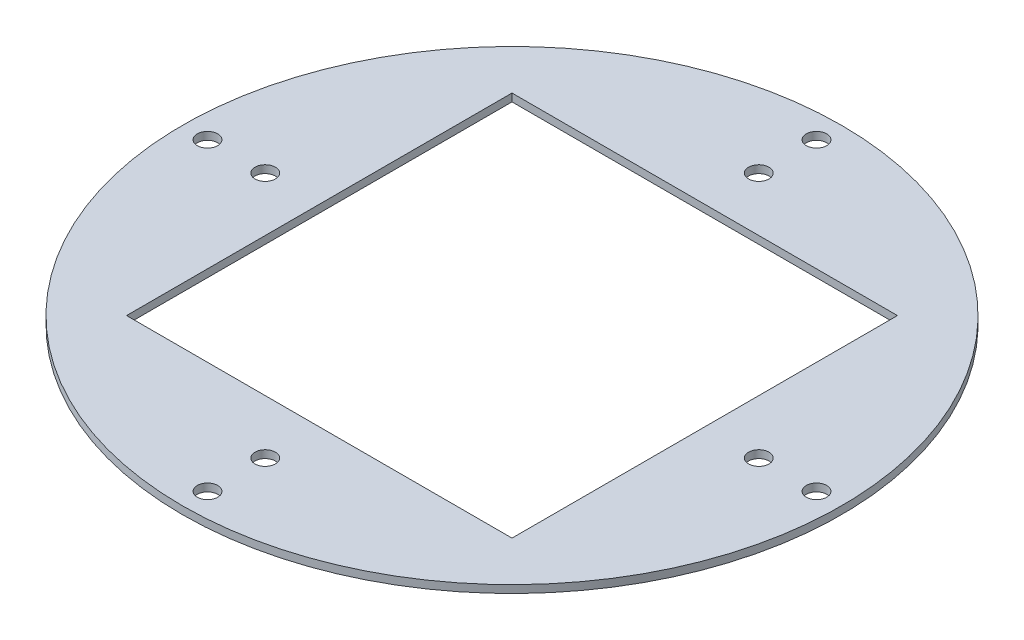
ISO-10303-21;
HEADER;
FILE_DESCRIPTION(('STEP AP214'),'2;1');
FILE_NAME('part.step','',(''),(''),'','','');
FILE_SCHEMA(('AUTOMOTIVE_DESIGN { 1 0 10303 214 1 1 1 1 }'));
ENDSEC;
DATA;
#1=APPLICATION_CONTEXT('core data for automotive mechanical design processes');
#2=APPLICATION_PROTOCOL_DEFINITION('international standard','automotive_design',2000,#1);
#3=PRODUCT_CONTEXT('',#1,'mechanical');
#4=PRODUCT('Part','Part','',(#3));
#5=PRODUCT_RELATED_PRODUCT_CATEGORY('part','',(#4));
#6=PRODUCT_DEFINITION_FORMATION('','',#4);
#7=PRODUCT_DEFINITION_CONTEXT('part definition',#1,'design');
#8=PRODUCT_DEFINITION('design','',#6,#7);
#9=PRODUCT_DEFINITION_SHAPE('','',#8);
#10=(LENGTH_UNIT() NAMED_UNIT(*) SI_UNIT(.MILLI.,.METRE.));
#11=(NAMED_UNIT(*) PLANE_ANGLE_UNIT() SI_UNIT($,.RADIAN.));
#12=(NAMED_UNIT(*) SI_UNIT($,.STERADIAN.) SOLID_ANGLE_UNIT());
#13=UNCERTAINTY_MEASURE_WITH_UNIT(LENGTH_MEASURE(1.E-05),#10,'distance_accuracy_value','');
#14=(GEOMETRIC_REPRESENTATION_CONTEXT(3) GLOBAL_UNCERTAINTY_ASSIGNED_CONTEXT((#13)) GLOBAL_UNIT_ASSIGNED_CONTEXT((#10,
#11,#12)) REPRESENTATION_CONTEXT('',''));
#15=CARTESIAN_POINT('',(0.,0.,0.));
#16=DIRECTION('',(0.,0.,1.));
#17=DIRECTION('',(1.,0.,0.));
#18=AXIS2_PLACEMENT_3D('',#15,#16,#17);
#19=CARTESIAN_POINT('',(0.,2.,0.));
#20=DIRECTION('',(0.,1.,0.));
#21=DIRECTION('',(0.,0.,1.));
#22=AXIS2_PLACEMENT_3D('',#19,#20,#21);
#23=PLANE('',#22);
#24=DIRECTION('',(0.,0.,-1.));
#25=VECTOR('',#24,1.);
#26=CARTESIAN_POINT('',(50.,2.,50.));
#27=LINE('',#26,#25);
#28=CARTESIAN_POINT('',(50.,2.,50.));
#29=VERTEX_POINT('',#28);
#30=CARTESIAN_POINT('',(50.,2.,-50.));
#31=VERTEX_POINT('',#30);
#32=EDGE_CURVE('E123',#29,#31,#27,.T.);
#33=ORIENTED_EDGE('',*,*,#32,.F.);
#34=DIRECTION('',(1.,0.,0.));
#35=VECTOR('',#34,1.);
#36=CARTESIAN_POINT('',(0.,2.,50.));
#37=LINE('',#36,#35);
#38=CARTESIAN_POINT('',(-50.,2.,50.));
#39=VERTEX_POINT('',#38);
#40=EDGE_CURVE('E83',#39,#29,#37,.T.);
#41=ORIENTED_EDGE('',*,*,#40,.F.);
#42=DIRECTION('',(0.,0.,1.));
#43=VECTOR('',#42,1.);
#44=CARTESIAN_POINT('',(-50.,2.,50.));
#45=LINE('',#44,#43);
#46=CARTESIAN_POINT('',(-50.,2.,-50.));
#47=VERTEX_POINT('',#46);
#48=EDGE_CURVE('E120',#47,#39,#45,.T.);
#49=ORIENTED_EDGE('',*,*,#48,.F.);
#50=DIRECTION('',(1.,0.,0.));
#51=VECTOR('',#50,1.);
#52=CARTESIAN_POINT('',(0.,2.,-50.));
#53=LINE('',#52,#51);
#54=EDGE_CURVE('E106',#47,#31,#53,.T.);
#55=ORIENTED_EDGE('',*,*,#54,.T.);
#56=EDGE_LOOP('',(#33,#41,#49,#55));
#57=FACE_BOUND('',#56,.T.);
#58=CARTESIAN_POINT('',(0.,2.,-64.0312423743285));
#59=DIRECTION('',(0.,1.,0.));
#60=DIRECTION('',(0.,0.,1.));
#61=AXIS2_PLACEMENT_3D('',#58,#59,#60);
#62=CIRCLE('',#61,2.65);
#63=CARTESIAN_POINT('',(0.,2.,-61.3812423743285));
#64=VERTEX_POINT('',#63);
#65=EDGE_CURVE('E139',#64,#64,#62,.T.);
#66=ORIENTED_EDGE('',*,*,#65,.F.);
#67=EDGE_LOOP('',(#66));
#68=FACE_BOUND('',#67,.T.);
#69=CARTESIAN_POINT('',(-64.0312423743285,2.,-6.70691663558729E-13));
#70=DIRECTION('',(0.,1.,0.));
#71=DIRECTION('',(0.,0.,1.));
#72=AXIS2_PLACEMENT_3D('',#69,#70,#71);
#73=CIRCLE('',#72,2.65);
#74=CARTESIAN_POINT('',(-64.0312423743285,2.,2.64999999999933));
#75=VERTEX_POINT('',#74);
#76=EDGE_CURVE('E143',#75,#75,#73,.T.);
#77=ORIENTED_EDGE('',*,*,#76,.F.);
#78=EDGE_LOOP('',(#77));
#79=FACE_BOUND('',#78,.T.);
#80=CARTESIAN_POINT('',(64.0312423743285,2.,2.2356388785291E-13));
#81=DIRECTION('',(0.,1.,0.));
#82=DIRECTION('',(0.,0.,1.));
#83=AXIS2_PLACEMENT_3D('',#80,#81,#82);
#84=CIRCLE('',#83,2.65);
#85=CARTESIAN_POINT('',(64.0312423743285,2.,2.65000000000022));
#86=VERTEX_POINT('',#85);
#87=EDGE_CURVE('E151',#86,#86,#84,.T.);
#88=ORIENTED_EDGE('',*,*,#87,.F.);
#89=EDGE_LOOP('',(#88));
#90=FACE_BOUND('',#89,.T.);
#91=CARTESIAN_POINT('',(-4.47127775705819E-13,2.,64.0312423743285));
#92=DIRECTION('',(0.,1.,0.));
#93=DIRECTION('',(0.,0.,1.));
#94=AXIS2_PLACEMENT_3D('',#91,#92,#93);
#95=CIRCLE('',#94,2.65);
#96=CARTESIAN_POINT('',(-4.47127775705819E-13,2.,66.6812423743285));
#97=VERTEX_POINT('',#96);
#98=EDGE_CURVE('E159',#97,#97,#95,.T.);
#99=ORIENTED_EDGE('',*,*,#98,.F.);
#100=EDGE_LOOP('',(#99));
#101=FACE_BOUND('',#100,.T.);
#102=CARTESIAN_POINT('',(0.,2.,-79.));
#103=DIRECTION('',(0.,1.,0.));
#104=DIRECTION('',(0.,0.,1.));
#105=AXIS2_PLACEMENT_3D('',#102,#103,#104);
#106=CIRCLE('',#105,2.65);
#107=CARTESIAN_POINT('',(0.,2.,-76.35));
#108=VERTEX_POINT('',#107);
#109=EDGE_CURVE('E173',#108,#108,#106,.T.);
#110=ORIENTED_EDGE('',*,*,#109,.F.);
#111=EDGE_LOOP('',(#110));
#112=FACE_BOUND('',#111,.T.);
#113=CARTESIAN_POINT('',(-79.,2.,-8.27481077305823E-13));
#114=DIRECTION('',(0.,1.,0.));
#115=DIRECTION('',(0.,0.,1.));
#116=AXIS2_PLACEMENT_3D('',#113,#114,#115);
#117=CIRCLE('',#116,2.65);
#118=CARTESIAN_POINT('',(-79.,2.,2.64999999999917));
#119=VERTEX_POINT('',#118);
#120=EDGE_CURVE('E177',#119,#119,#117,.T.);
#121=ORIENTED_EDGE('',*,*,#120,.F.);
#122=EDGE_LOOP('',(#121));
#123=FACE_BOUND('',#122,.T.);
#124=CARTESIAN_POINT('',(-5.51654051537215E-13,2.,79.));
#125=DIRECTION('',(0.,1.,0.));
#126=DIRECTION('',(0.,0.,1.));
#127=AXIS2_PLACEMENT_3D('',#124,#125,#126);
#128=CIRCLE('',#127,2.65);
#129=CARTESIAN_POINT('',(-5.51654051537215E-13,2.,81.65));
#130=VERTEX_POINT('',#129);
#131=EDGE_CURVE('E181',#130,#130,#128,.T.);
#132=ORIENTED_EDGE('',*,*,#131,.F.);
#133=EDGE_LOOP('',(#132));
#134=FACE_BOUND('',#133,.T.);
#135=CARTESIAN_POINT('',(79.,2.,2.75827025768608E-13));
#136=DIRECTION('',(0.,1.,0.));
#137=DIRECTION('',(0.,0.,1.));
#138=AXIS2_PLACEMENT_3D('',#135,#136,#137);
#139=CIRCLE('',#138,2.65);
#140=CARTESIAN_POINT('',(79.,2.,2.65000000000027));
#141=VERTEX_POINT('',#140);
#142=EDGE_CURVE('E57',#141,#141,#139,.T.);
#143=ORIENTED_EDGE('',*,*,#142,.F.);
#144=EDGE_LOOP('',(#143));
#145=FACE_BOUND('',#144,.T.);
#146=CARTESIAN_POINT('',(0.,2.,0.));
#147=DIRECTION('',(0.,1.,0.));
#148=DIRECTION('',(0.,0.,1.));
#149=AXIS2_PLACEMENT_3D('',#146,#147,#148);
#150=CIRCLE('',#149,85.5);
#151=CARTESIAN_POINT('',(0.,2.,85.5));
#152=VERTEX_POINT('',#151);
#153=EDGE_CURVE('E11',#152,#152,#150,.T.);
#154=ORIENTED_EDGE('',*,*,#153,.T.);
#155=EDGE_LOOP('',(#154));
#156=FACE_BOUND('',#155,.T.);
#157=ADVANCED_FACE('F46',(#57,#68,#79,#90,#101,#112,#123,#134,#145,#156),#23,.T.);
#158=CARTESIAN_POINT('',(0.,0.,0.));
#159=DIRECTION('',(0.,1.,0.));
#160=DIRECTION('',(0.,0.,1.));
#161=AXIS2_PLACEMENT_3D('',#158,#159,#160);
#162=PLANE('',#161);
#163=CARTESIAN_POINT('',(0.,0.,-64.0312423743285));
#164=DIRECTION('',(0.,1.,0.));
#165=DIRECTION('',(0.,0.,1.));
#166=AXIS2_PLACEMENT_3D('',#163,#164,#165);
#167=CIRCLE('',#166,2.65);
#168=CARTESIAN_POINT('',(0.,0.,-61.3812423743285));
#169=VERTEX_POINT('',#168);
#170=EDGE_CURVE('E135',#169,#169,#167,.T.);
#171=ORIENTED_EDGE('',*,*,#170,.T.);
#172=EDGE_LOOP('',(#171));
#173=FACE_BOUND('',#172,.T.);
#174=CARTESIAN_POINT('',(-64.0312423743285,0.,-6.70691663558729E-13));
#175=DIRECTION('',(0.,1.,0.));
#176=DIRECTION('',(0.,0.,1.));
#177=AXIS2_PLACEMENT_3D('',#174,#175,#176);
#178=CIRCLE('',#177,2.65);
#179=CARTESIAN_POINT('',(-64.0312423743285,0.,2.64999999999933));
#180=VERTEX_POINT('',#179);
#181=EDGE_CURVE('E147',#180,#180,#178,.T.);
#182=ORIENTED_EDGE('',*,*,#181,.T.);
#183=EDGE_LOOP('',(#182));
#184=FACE_BOUND('',#183,.T.);
#185=CARTESIAN_POINT('',(64.0312423743285,0.,2.2356388785291E-13));
#186=DIRECTION('',(0.,1.,0.));
#187=DIRECTION('',(0.,0.,1.));
#188=AXIS2_PLACEMENT_3D('',#185,#186,#187);
#189=CIRCLE('',#188,2.65);
#190=CARTESIAN_POINT('',(64.0312423743285,0.,2.65000000000022));
#191=VERTEX_POINT('',#190);
#192=EDGE_CURVE('E155',#191,#191,#189,.T.);
#193=ORIENTED_EDGE('',*,*,#192,.T.);
#194=EDGE_LOOP('',(#193));
#195=FACE_BOUND('',#194,.T.);
#196=CARTESIAN_POINT('',(-4.47127775705819E-13,0.,64.0312423743285));
#197=DIRECTION('',(0.,1.,0.));
#198=DIRECTION('',(0.,0.,1.));
#199=AXIS2_PLACEMENT_3D('',#196,#197,#198);
#200=CIRCLE('',#199,2.65);
#201=CARTESIAN_POINT('',(-4.47127775705819E-13,0.,66.6812423743285));
#202=VERTEX_POINT('',#201);
#203=EDGE_CURVE('E132',#202,#202,#200,.T.);
#204=ORIENTED_EDGE('',*,*,#203,.T.);
#205=EDGE_LOOP('',(#204));
#206=FACE_BOUND('',#205,.T.);
#207=CARTESIAN_POINT('',(0.,0.,0.));
#208=DIRECTION('',(0.,1.,0.));
#209=DIRECTION('',(0.,0.,1.));
#210=AXIS2_PLACEMENT_3D('',#207,#208,#209);
#211=CIRCLE('',#210,85.5);
#212=CARTESIAN_POINT('',(0.,0.,85.5));
#213=VERTEX_POINT('',#212);
#214=EDGE_CURVE('E50',#213,#213,#211,.T.);
#215=ORIENTED_EDGE('',*,*,#214,.F.);
#216=EDGE_LOOP('',(#215));
#217=FACE_BOUND('',#216,.T.);
#218=CARTESIAN_POINT('',(79.,0.,2.75827025768608E-13));
#219=DIRECTION('',(0.,1.,0.));
#220=DIRECTION('',(0.,0.,1.));
#221=AXIS2_PLACEMENT_3D('',#218,#219,#220);
#222=CIRCLE('',#221,2.65);
#223=CARTESIAN_POINT('',(79.,0.,2.65000000000027));
#224=VERTEX_POINT('',#223);
#225=EDGE_CURVE('E198',#224,#224,#222,.T.);
#226=ORIENTED_EDGE('',*,*,#225,.T.);
#227=EDGE_LOOP('',(#226));
#228=FACE_BOUND('',#227,.T.);
#229=CARTESIAN_POINT('',(-5.51654051537215E-13,0.,79.));
#230=DIRECTION('',(0.,1.,0.));
#231=DIRECTION('',(0.,0.,1.));
#232=AXIS2_PLACEMENT_3D('',#229,#230,#231);
#233=CIRCLE('',#232,2.65);
#234=CARTESIAN_POINT('',(-5.51654051537215E-13,0.,81.65));
#235=VERTEX_POINT('',#234);
#236=EDGE_CURVE('E195',#235,#235,#233,.T.);
#237=ORIENTED_EDGE('',*,*,#236,.T.);
#238=EDGE_LOOP('',(#237));
#239=FACE_BOUND('',#238,.T.);
#240=CARTESIAN_POINT('',(-79.,0.,-8.27481077305823E-13));
#241=DIRECTION('',(0.,1.,0.));
#242=DIRECTION('',(0.,0.,1.));
#243=AXIS2_PLACEMENT_3D('',#240,#241,#242);
#244=CIRCLE('',#243,2.65);
#245=CARTESIAN_POINT('',(-79.,0.,2.64999999999917));
#246=VERTEX_POINT('',#245);
#247=EDGE_CURVE('E191',#246,#246,#244,.T.);
#248=ORIENTED_EDGE('',*,*,#247,.T.);
#249=EDGE_LOOP('',(#248));
#250=FACE_BOUND('',#249,.T.);
#251=CARTESIAN_POINT('',(0.,0.,-79.));
#252=DIRECTION('',(0.,1.,0.));
#253=DIRECTION('',(0.,0.,1.));
#254=AXIS2_PLACEMENT_3D('',#251,#252,#253);
#255=CIRCLE('',#254,2.65);
#256=CARTESIAN_POINT('',(0.,0.,-76.35));
#257=VERTEX_POINT('',#256);
#258=EDGE_CURVE('E168',#257,#257,#255,.T.);
#259=ORIENTED_EDGE('',*,*,#258,.T.);
#260=EDGE_LOOP('',(#259));
#261=FACE_BOUND('',#260,.T.);
#262=DIRECTION('',(1.,0.,0.));
#263=VECTOR('',#262,1.);
#264=CARTESIAN_POINT('',(0.,0.,50.));
#265=LINE('',#264,#263);
#266=CARTESIAN_POINT('',(-50.,0.,50.));
#267=VERTEX_POINT('',#266);
#268=CARTESIAN_POINT('',(50.,0.,50.));
#269=VERTEX_POINT('',#268);
#270=EDGE_CURVE('E66',#267,#269,#265,.T.);
#271=ORIENTED_EDGE('',*,*,#270,.T.);
#272=DIRECTION('',(0.,0.,-1.));
#273=VECTOR('',#272,1.);
#274=CARTESIAN_POINT('',(50.,0.,50.));
#275=LINE('',#274,#273);
#276=CARTESIAN_POINT('',(50.,0.,-50.));
#277=VERTEX_POINT('',#276);
#278=EDGE_CURVE('E100',#269,#277,#275,.T.);
#279=ORIENTED_EDGE('',*,*,#278,.T.);
#280=DIRECTION('',(1.,0.,0.));
#281=VECTOR('',#280,1.);
#282=CARTESIAN_POINT('',(0.,0.,-50.));
#283=LINE('',#282,#281);
#284=CARTESIAN_POINT('',(-50.,0.,-50.));
#285=VERTEX_POINT('',#284);
#286=EDGE_CURVE('E94',#285,#277,#283,.T.);
#287=ORIENTED_EDGE('',*,*,#286,.F.);
#288=DIRECTION('',(0.,0.,1.));
#289=VECTOR('',#288,1.);
#290=CARTESIAN_POINT('',(-50.,0.,50.));
#291=LINE('',#290,#289);
#292=EDGE_CURVE('E98',#285,#267,#291,.T.);
#293=ORIENTED_EDGE('',*,*,#292,.T.);
#294=EDGE_LOOP('',(#271,#279,#287,#293));
#295=FACE_BOUND('',#294,.T.);
#296=ADVANCED_FACE('F96',(#173,#184,#195,#206,#217,#228,#239,#250,#261,#295),#162,.F.);
#297=CARTESIAN_POINT('',(79.,2.,2.75827025768608E-13));
#298=DIRECTION('',(0.,-1.,0.));
#299=DIRECTION('',(0.,0.,-1.));
#300=AXIS2_PLACEMENT_3D('',#297,#298,#299);
#301=CYLINDRICAL_SURFACE('',#300,2.65);
#302=ORIENTED_EDGE('',*,*,#142,.T.);
#303=EDGE_LOOP('',(#302));
#304=FACE_BOUND('',#303,.T.);
#305=ORIENTED_EDGE('',*,*,#225,.F.);
#306=EDGE_LOOP('',(#305));
#307=FACE_BOUND('',#306,.T.);
#308=ADVANCED_FACE('F210',(#304,#307),#301,.F.);
#309=CARTESIAN_POINT('',(-5.51654051537215E-13,2.,79.));
#310=DIRECTION('',(0.,-1.,0.));
#311=DIRECTION('',(0.,0.,-1.));
#312=AXIS2_PLACEMENT_3D('',#309,#310,#311);
#313=CYLINDRICAL_SURFACE('',#312,2.65);
#314=ORIENTED_EDGE('',*,*,#131,.T.);
#315=EDGE_LOOP('',(#314));
#316=FACE_BOUND('',#315,.T.);
#317=ORIENTED_EDGE('',*,*,#236,.F.);
#318=EDGE_LOOP('',(#317));
#319=FACE_BOUND('',#318,.T.);
#320=ADVANCED_FACE('F229',(#316,#319),#313,.F.);
#321=CARTESIAN_POINT('',(-79.,2.,-8.27481077305823E-13));
#322=DIRECTION('',(0.,-1.,0.));
#323=DIRECTION('',(0.,0.,-1.));
#324=AXIS2_PLACEMENT_3D('',#321,#322,#323);
#325=CYLINDRICAL_SURFACE('',#324,2.65);
#326=ORIENTED_EDGE('',*,*,#120,.T.);
#327=EDGE_LOOP('',(#326));
#328=FACE_BOUND('',#327,.T.);
#329=ORIENTED_EDGE('',*,*,#247,.F.);
#330=EDGE_LOOP('',(#329));
#331=FACE_BOUND('',#330,.T.);
#332=ADVANCED_FACE('F221',(#328,#331),#325,.F.);
#333=CARTESIAN_POINT('',(0.,2.,-79.));
#334=DIRECTION('',(0.,-1.,0.));
#335=DIRECTION('',(0.,0.,-1.));
#336=AXIS2_PLACEMENT_3D('',#333,#334,#335);
#337=CYLINDRICAL_SURFACE('',#336,2.65);
#338=ORIENTED_EDGE('',*,*,#109,.T.);
#339=EDGE_LOOP('',(#338));
#340=FACE_BOUND('',#339,.T.);
#341=ORIENTED_EDGE('',*,*,#258,.F.);
#342=EDGE_LOOP('',(#341));
#343=FACE_BOUND('',#342,.T.);
#344=ADVANCED_FACE('F48',(#340,#343),#337,.F.);
#345=CARTESIAN_POINT('',(0.,2.,0.));
#346=DIRECTION('',(0.,-1.,0.));
#347=DIRECTION('',(0.,0.,-1.));
#348=AXIS2_PLACEMENT_3D('',#345,#346,#347);
#349=CYLINDRICAL_SURFACE('',#348,85.5);
#350=ORIENTED_EDGE('',*,*,#153,.F.);
#351=EDGE_LOOP('',(#350));
#352=FACE_BOUND('',#351,.T.);
#353=ORIENTED_EDGE('',*,*,#214,.T.);
#354=EDGE_LOOP('',(#353));
#355=FACE_BOUND('',#354,.T.);
#356=ADVANCED_FACE('F207',(#352,#355),#349,.T.);
#357=CARTESIAN_POINT('',(0.,0.,-50.));
#358=DIRECTION('',(0.,0.,1.));
#359=DIRECTION('',(1.,0.,0.));
#360=AXIS2_PLACEMENT_3D('',#357,#358,#359);
#361=PLANE('',#360);
#362=ORIENTED_EDGE('',*,*,#54,.F.);
#363=DIRECTION('',(0.,1.,0.));
#364=VECTOR('',#363,1.);
#365=CARTESIAN_POINT('',(-50.,0.,-50.));
#366=LINE('',#365,#364);
#367=EDGE_CURVE('E104',#285,#47,#366,.T.);
#368=ORIENTED_EDGE('',*,*,#367,.F.);
#369=ORIENTED_EDGE('',*,*,#286,.T.);
#370=DIRECTION('',(0.,1.,0.));
#371=VECTOR('',#370,1.);
#372=CARTESIAN_POINT('',(50.,0.,-50.));
#373=LINE('',#372,#371);
#374=EDGE_CURVE('E111',#277,#31,#373,.T.);
#375=ORIENTED_EDGE('',*,*,#374,.T.);
#376=EDGE_LOOP('',(#362,#368,#369,#375));
#377=FACE_BOUND('',#376,.T.);
#378=ADVANCED_FACE('F105',(#377),#361,.T.);
#379=CARTESIAN_POINT('',(0.,0.,50.));
#380=DIRECTION('',(0.,0.,1.));
#381=DIRECTION('',(1.,0.,0.));
#382=AXIS2_PLACEMENT_3D('',#379,#380,#381);
#383=PLANE('',#382);
#384=ORIENTED_EDGE('',*,*,#40,.T.);
#385=DIRECTION('',(0.,1.,0.));
#386=VECTOR('',#385,1.);
#387=CARTESIAN_POINT('',(50.,0.,50.));
#388=LINE('',#387,#386);
#389=EDGE_CURVE('E129',#269,#29,#388,.T.);
#390=ORIENTED_EDGE('',*,*,#389,.F.);
#391=ORIENTED_EDGE('',*,*,#270,.F.);
#392=DIRECTION('',(0.,1.,0.));
#393=VECTOR('',#392,1.);
#394=CARTESIAN_POINT('',(-50.,0.,50.));
#395=LINE('',#394,#393);
#396=EDGE_CURVE('E110',#267,#39,#395,.T.);
#397=ORIENTED_EDGE('',*,*,#396,.T.);
#398=EDGE_LOOP('',(#384,#390,#391,#397));
#399=FACE_BOUND('',#398,.T.);
#400=ADVANCED_FACE('F293',(#399),#383,.F.);
#401=CARTESIAN_POINT('',(-4.47127775705819E-13,0.,64.0312423743285));
#402=DIRECTION('',(0.,1.,0.));
#403=DIRECTION('',(0.,0.,1.));
#404=AXIS2_PLACEMENT_3D('',#401,#402,#403);
#405=CYLINDRICAL_SURFACE('',#404,2.65);
#406=ORIENTED_EDGE('',*,*,#203,.F.);
#407=EDGE_LOOP('',(#406));
#408=FACE_BOUND('',#407,.T.);
#409=ORIENTED_EDGE('',*,*,#98,.T.);
#410=EDGE_LOOP('',(#409));
#411=FACE_BOUND('',#410,.T.);
#412=ADVANCED_FACE('F304',(#408,#411),#405,.F.);
#413=CARTESIAN_POINT('',(64.0312423743285,0.,2.2356388785291E-13));
#414=DIRECTION('',(0.,1.,0.));
#415=DIRECTION('',(0.,0.,1.));
#416=AXIS2_PLACEMENT_3D('',#413,#414,#415);
#417=CYLINDRICAL_SURFACE('',#416,2.65);
#418=ORIENTED_EDGE('',*,*,#192,.F.);
#419=EDGE_LOOP('',(#418));
#420=FACE_BOUND('',#419,.T.);
#421=ORIENTED_EDGE('',*,*,#87,.T.);
#422=EDGE_LOOP('',(#421));
#423=FACE_BOUND('',#422,.T.);
#424=ADVANCED_FACE('F313',(#420,#423),#417,.F.);
#425=CARTESIAN_POINT('',(-64.0312423743285,0.,-6.70691663558729E-13));
#426=DIRECTION('',(0.,1.,0.));
#427=DIRECTION('',(0.,0.,1.));
#428=AXIS2_PLACEMENT_3D('',#425,#426,#427);
#429=CYLINDRICAL_SURFACE('',#428,2.65);
#430=ORIENTED_EDGE('',*,*,#181,.F.);
#431=EDGE_LOOP('',(#430));
#432=FACE_BOUND('',#431,.T.);
#433=ORIENTED_EDGE('',*,*,#76,.T.);
#434=EDGE_LOOP('',(#433));
#435=FACE_BOUND('',#434,.T.);
#436=ADVANCED_FACE('F323',(#432,#435),#429,.F.);
#437=CARTESIAN_POINT('',(0.,0.,-64.0312423743285));
#438=DIRECTION('',(0.,1.,0.));
#439=DIRECTION('',(0.,0.,1.));
#440=AXIS2_PLACEMENT_3D('',#437,#438,#439);
#441=CYLINDRICAL_SURFACE('',#440,2.65);
#442=ORIENTED_EDGE('',*,*,#170,.F.);
#443=EDGE_LOOP('',(#442));
#444=FACE_BOUND('',#443,.T.);
#445=ORIENTED_EDGE('',*,*,#65,.T.);
#446=EDGE_LOOP('',(#445));
#447=FACE_BOUND('',#446,.T.);
#448=ADVANCED_FACE('F332',(#444,#447),#441,.F.);
#449=CARTESIAN_POINT('',(-50.,0.,50.));
#450=DIRECTION('',(-1.,0.,0.));
#451=DIRECTION('',(0.,0.,1.));
#452=AXIS2_PLACEMENT_3D('',#449,#450,#451);
#453=PLANE('',#452);
#454=ORIENTED_EDGE('',*,*,#48,.T.);
#455=ORIENTED_EDGE('',*,*,#396,.F.);
#456=ORIENTED_EDGE('',*,*,#292,.F.);
#457=ORIENTED_EDGE('',*,*,#367,.T.);
#458=EDGE_LOOP('',(#454,#455,#456,#457));
#459=FACE_BOUND('',#458,.T.);
#460=ADVANCED_FACE('F114',(#459),#453,.F.);
#461=CARTESIAN_POINT('',(50.,0.,50.));
#462=DIRECTION('',(1.,0.,0.));
#463=DIRECTION('',(0.,0.,-1.));
#464=AXIS2_PLACEMENT_3D('',#461,#462,#463);
#465=PLANE('',#464);
#466=ORIENTED_EDGE('',*,*,#32,.T.);
#467=ORIENTED_EDGE('',*,*,#374,.F.);
#468=ORIENTED_EDGE('',*,*,#278,.F.);
#469=ORIENTED_EDGE('',*,*,#389,.T.);
#470=EDGE_LOOP('',(#466,#467,#468,#469));
#471=FACE_BOUND('',#470,.T.);
#472=ADVANCED_FACE('F348',(#471),#465,.F.);
#473=CLOSED_SHELL('',(#157,#296,#308,#320,#332,#344,#356,#378,#400,#412,#424,#436,#448,#460,#472));
#474=MANIFOLD_SOLID_BREP('B2',#473);
#475=ADVANCED_BREP_SHAPE_REPRESENTATION('',(#18,#474),#14);
#476=SHAPE_DEFINITION_REPRESENTATION(#9,#475);
ENDSEC;
END-ISO-10303-21;
